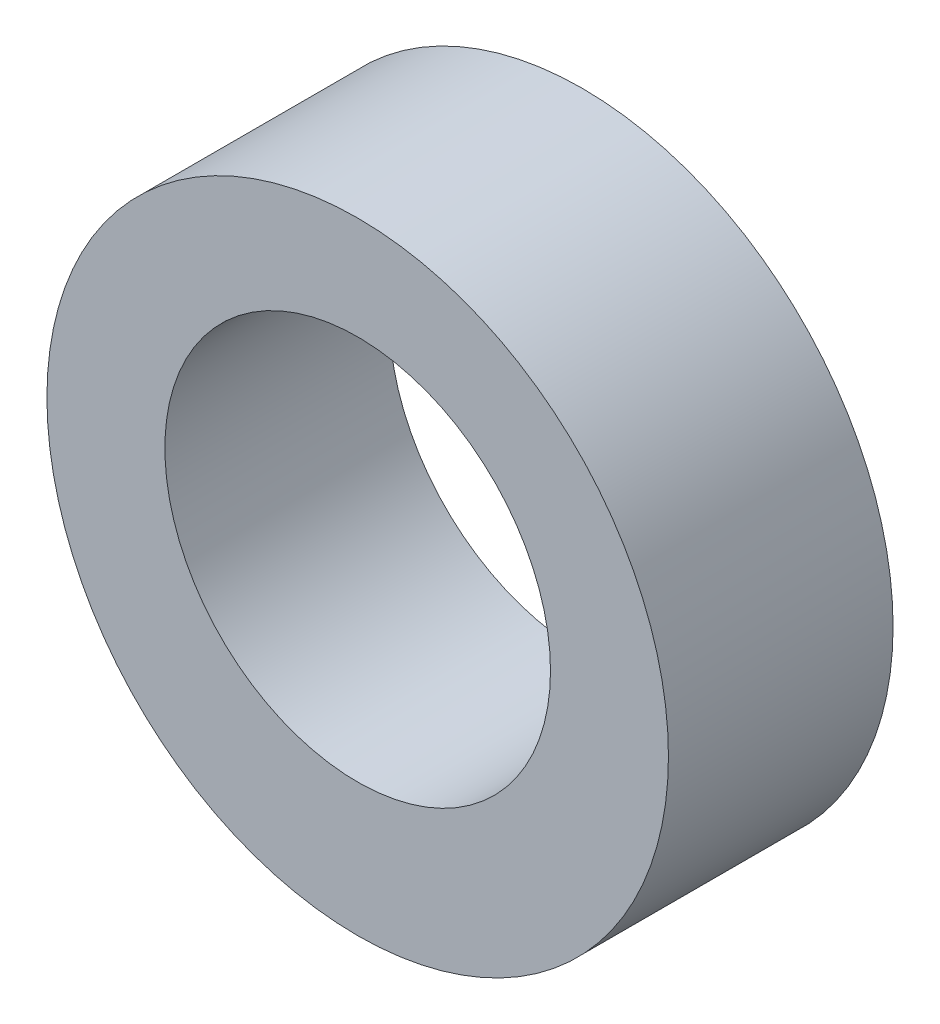
ISO-10303-21;
HEADER;
FILE_DESCRIPTION(('STEP AP214'),'2;1');
FILE_NAME('part.step','',(''),(''),'','','');
FILE_SCHEMA(('AUTOMOTIVE_DESIGN { 1 0 10303 214 1 1 1 1 }'));
ENDSEC;
DATA;
#1=APPLICATION_CONTEXT('core data for automotive mechanical design processes');
#2=APPLICATION_PROTOCOL_DEFINITION('international standard','automotive_design',2000,#1);
#3=PRODUCT_CONTEXT('',#1,'mechanical');
#4=PRODUCT('Part','Part','',(#3));
#5=PRODUCT_RELATED_PRODUCT_CATEGORY('part','',(#4));
#6=PRODUCT_DEFINITION_FORMATION('','',#4);
#7=PRODUCT_DEFINITION_CONTEXT('part definition',#1,'design');
#8=PRODUCT_DEFINITION('design','',#6,#7);
#9=PRODUCT_DEFINITION_SHAPE('','',#8);
#10=(LENGTH_UNIT() NAMED_UNIT(*) SI_UNIT(.MILLI.,.METRE.));
#11=(NAMED_UNIT(*) PLANE_ANGLE_UNIT() SI_UNIT($,.RADIAN.));
#12=(NAMED_UNIT(*) SI_UNIT($,.STERADIAN.) SOLID_ANGLE_UNIT());
#13=UNCERTAINTY_MEASURE_WITH_UNIT(LENGTH_MEASURE(1.E-05),#10,'distance_accuracy_value','');
#14=(GEOMETRIC_REPRESENTATION_CONTEXT(3) GLOBAL_UNCERTAINTY_ASSIGNED_CONTEXT((#13)) GLOBAL_UNIT_ASSIGNED_CONTEXT((#10,
#11,#12)) REPRESENTATION_CONTEXT('',''));
#15=CARTESIAN_POINT('',(0.,0.,0.));
#16=DIRECTION('',(0.,0.,1.));
#17=DIRECTION('',(1.,0.,0.));
#18=AXIS2_PLACEMENT_3D('',#15,#16,#17);
#19=CARTESIAN_POINT('',(0.,14.9368133675051,50.));
#20=DIRECTION('',(0.,0.,-1.));
#21=DIRECTION('',(-1.,0.,0.));
#22=AXIS2_PLACEMENT_3D('',#19,#20,#21);
#23=CYLINDRICAL_SURFACE('',#22,69.174019300943);
#24=CARTESIAN_POINT('',(0.,14.9368133675051,50.));
#25=DIRECTION('',(0.,0.,1.));
#26=DIRECTION('',(1.,0.,0.));
#27=AXIS2_PLACEMENT_3D('',#24,#25,#26);
#28=CIRCLE('',#27,69.174019300943);
#29=CARTESIAN_POINT('',(69.174019300943,14.9368133675051,50.));
#30=VERTEX_POINT('',#29);
#31=EDGE_CURVE('E10',#30,#30,#28,.T.);
#32=ORIENTED_EDGE('',*,*,#31,.F.);
#33=EDGE_LOOP('',(#32));
#34=FACE_BOUND('',#33,.T.);
#35=CARTESIAN_POINT('',(0.,14.9368133675051,0.));
#36=DIRECTION('',(0.,0.,1.));
#37=DIRECTION('',(1.,0.,0.));
#38=AXIS2_PLACEMENT_3D('',#35,#36,#37);
#39=CIRCLE('',#38,69.174019300943);
#40=CARTESIAN_POINT('',(69.174019300943,14.9368133675051,0.));
#41=VERTEX_POINT('',#40);
#42=EDGE_CURVE('E34',#41,#41,#39,.T.);
#43=ORIENTED_EDGE('',*,*,#42,.T.);
#44=EDGE_LOOP('',(#43));
#45=FACE_BOUND('',#44,.T.);
#46=ADVANCED_FACE('F31',(#34,#45),#23,.T.);
#47=CARTESIAN_POINT('',(0.,14.9368133675051,50.));
#48=DIRECTION('',(0.,0.,1.));
#49=DIRECTION('',(1.,0.,0.));
#50=AXIS2_PLACEMENT_3D('',#47,#48,#49);
#51=PLANE('',#50);
#52=CARTESIAN_POINT('',(0.,18.2875537917677,50.));
#53=DIRECTION('',(0.,0.,1.));
#54=DIRECTION('',(1.,0.,0.));
#55=AXIS2_PLACEMENT_3D('',#52,#53,#54);
#56=CIRCLE('',#55,42.9183274836683);
#57=CARTESIAN_POINT('',(42.9183274836683,18.2875537917677,50.));
#58=VERTEX_POINT('',#57);
#59=EDGE_CURVE('E43',#58,#58,#56,.T.);
#60=ORIENTED_EDGE('',*,*,#59,.F.);
#61=EDGE_LOOP('',(#60));
#62=FACE_BOUND('',#61,.T.);
#63=ORIENTED_EDGE('',*,*,#31,.T.);
#64=EDGE_LOOP('',(#63));
#65=FACE_BOUND('',#64,.T.);
#66=ADVANCED_FACE('F58',(#62,#65),#51,.T.);
#67=CARTESIAN_POINT('',(0.,14.9368133675051,0.));
#68=DIRECTION('',(0.,0.,1.));
#69=DIRECTION('',(1.,0.,0.));
#70=AXIS2_PLACEMENT_3D('',#67,#68,#69);
#71=PLANE('',#70);
#72=CARTESIAN_POINT('',(0.,18.2875537917677,0.));
#73=DIRECTION('',(0.,0.,1.));
#74=DIRECTION('',(1.,0.,0.));
#75=AXIS2_PLACEMENT_3D('',#72,#73,#74);
#76=CIRCLE('',#75,42.9183274836683);
#77=CARTESIAN_POINT('',(42.9183274836683,18.2875537917677,0.));
#78=VERTEX_POINT('',#77);
#79=EDGE_CURVE('E41',#78,#78,#76,.T.);
#80=ORIENTED_EDGE('',*,*,#79,.T.);
#81=EDGE_LOOP('',(#80));
#82=FACE_BOUND('',#81,.T.);
#83=ORIENTED_EDGE('',*,*,#42,.F.);
#84=EDGE_LOOP('',(#83));
#85=FACE_BOUND('',#84,.T.);
#86=ADVANCED_FACE('F49',(#82,#85),#71,.F.);
#87=CARTESIAN_POINT('',(0.,18.2875537917677,0.));
#88=DIRECTION('',(0.,0.,1.));
#89=DIRECTION('',(1.,0.,0.));
#90=AXIS2_PLACEMENT_3D('',#87,#88,#89);
#91=CYLINDRICAL_SURFACE('',#90,42.9183274836683);
#92=ORIENTED_EDGE('',*,*,#79,.F.);
#93=EDGE_LOOP('',(#92));
#94=FACE_BOUND('',#93,.T.);
#95=ORIENTED_EDGE('',*,*,#59,.T.);
#96=EDGE_LOOP('',(#95));
#97=FACE_BOUND('',#96,.T.);
#98=ADVANCED_FACE('F52',(#94,#97),#91,.F.);
#99=CLOSED_SHELL('',(#46,#66,#86,#98));
#100=MANIFOLD_SOLID_BREP('B2',#99);
#101=ADVANCED_BREP_SHAPE_REPRESENTATION('',(#18,#100),#14);
#102=SHAPE_DEFINITION_REPRESENTATION(#9,#101);
ENDSEC;
END-ISO-10303-21;
